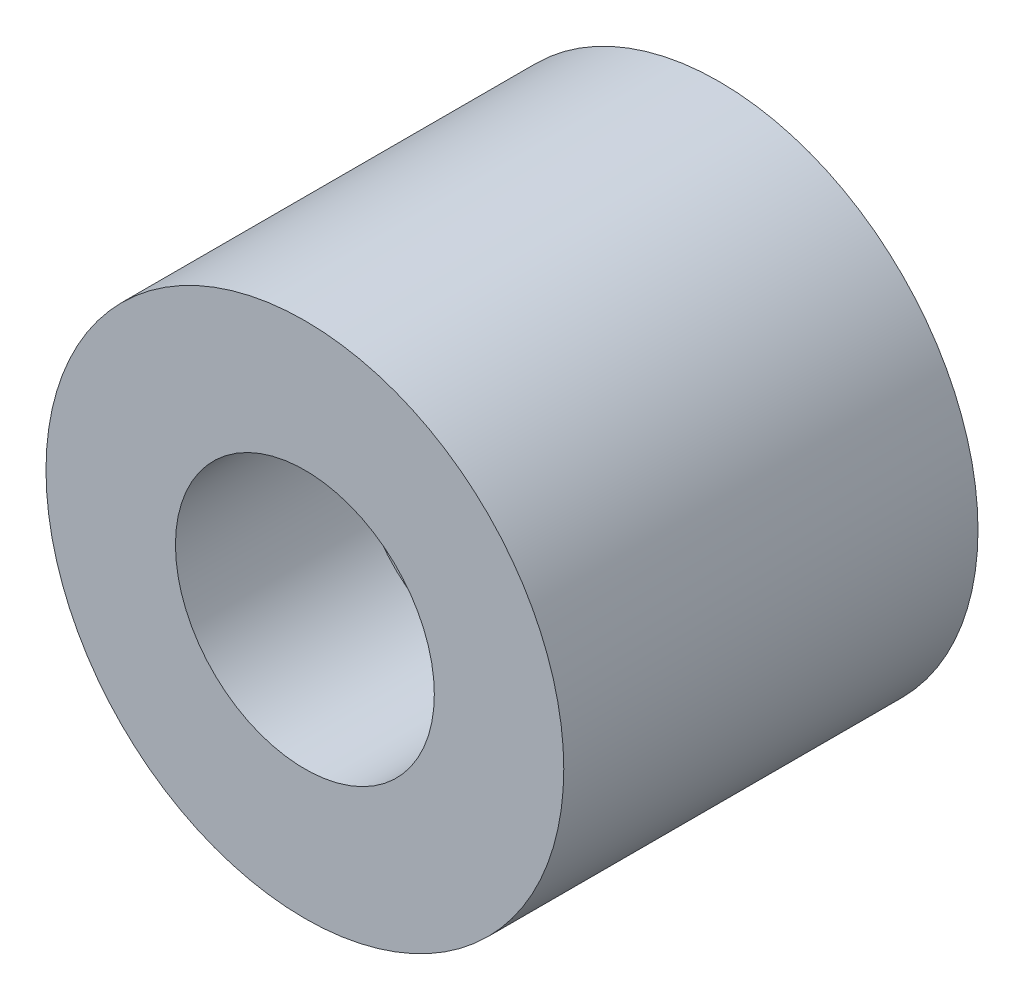
ISO-10303-21;
HEADER;
FILE_DESCRIPTION(('STEP AP214'),'2;1');
FILE_NAME('part.step','',(''),(''),'','','');
FILE_SCHEMA(('AUTOMOTIVE_DESIGN { 1 0 10303 214 1 1 1 1 }'));
ENDSEC;
DATA;
#1=APPLICATION_CONTEXT('core data for automotive mechanical design processes');
#2=APPLICATION_PROTOCOL_DEFINITION('international standard','automotive_design',2000,#1);
#3=PRODUCT_CONTEXT('',#1,'mechanical');
#4=PRODUCT('Part','Part','',(#3));
#5=PRODUCT_RELATED_PRODUCT_CATEGORY('part','',(#4));
#6=PRODUCT_DEFINITION_FORMATION('','',#4);
#7=PRODUCT_DEFINITION_CONTEXT('part definition',#1,'design');
#8=PRODUCT_DEFINITION('design','',#6,#7);
#9=PRODUCT_DEFINITION_SHAPE('','',#8);
#10=(LENGTH_UNIT() NAMED_UNIT(*) SI_UNIT(.MILLI.,.METRE.));
#11=(NAMED_UNIT(*) PLANE_ANGLE_UNIT() SI_UNIT($,.RADIAN.));
#12=(NAMED_UNIT(*) SI_UNIT($,.STERADIAN.) SOLID_ANGLE_UNIT());
#13=UNCERTAINTY_MEASURE_WITH_UNIT(LENGTH_MEASURE(1.E-05),#10,'distance_accuracy_value','');
#14=(GEOMETRIC_REPRESENTATION_CONTEXT(3) GLOBAL_UNCERTAINTY_ASSIGNED_CONTEXT((#13)) GLOBAL_UNIT_ASSIGNED_CONTEXT((#10,
#11,#12)) REPRESENTATION_CONTEXT('',''));
#15=CARTESIAN_POINT('',(0.,0.,0.));
#16=DIRECTION('',(0.,0.,1.));
#17=DIRECTION('',(1.,0.,0.));
#18=AXIS2_PLACEMENT_3D('',#15,#16,#17);
#19=CARTESIAN_POINT('',(0.,0.,10.16));
#20=DIRECTION('',(0.,0.,-1.));
#21=DIRECTION('',(-1.,0.,0.));
#22=AXIS2_PLACEMENT_3D('',#19,#20,#21);
#23=CYLINDRICAL_SURFACE('',#22,6.35);
#24=CARTESIAN_POINT('',(0.,0.,10.16));
#25=DIRECTION('',(0.,0.,1.));
#26=DIRECTION('',(1.,0.,0.));
#27=AXIS2_PLACEMENT_3D('',#24,#25,#26);
#28=CIRCLE('',#27,6.35);
#29=CARTESIAN_POINT('',(6.35,0.,10.16));
#30=VERTEX_POINT('',#29);
#31=EDGE_CURVE('E10',#30,#30,#28,.T.);
#32=ORIENTED_EDGE('',*,*,#31,.F.);
#33=EDGE_LOOP('',(#32));
#34=FACE_BOUND('',#33,.T.);
#35=CARTESIAN_POINT('',(0.,0.,0.));
#36=DIRECTION('',(0.,0.,1.));
#37=DIRECTION('',(1.,0.,0.));
#38=AXIS2_PLACEMENT_3D('',#35,#36,#37);
#39=CIRCLE('',#38,6.35);
#40=CARTESIAN_POINT('',(6.35,0.,0.));
#41=VERTEX_POINT('',#40);
#42=EDGE_CURVE('E46',#41,#41,#39,.T.);
#43=ORIENTED_EDGE('',*,*,#42,.T.);
#44=EDGE_LOOP('',(#43));
#45=FACE_BOUND('',#44,.T.);
#46=ADVANCED_FACE('F43',(#34,#45),#23,.T.);
#47=CARTESIAN_POINT('',(0.,0.,10.16));
#48=DIRECTION('',(0.,0.,1.));
#49=DIRECTION('',(1.,0.,0.));
#50=AXIS2_PLACEMENT_3D('',#47,#48,#49);
#51=PLANE('',#50);
#52=CARTESIAN_POINT('',(0.,0.,10.16));
#53=DIRECTION('',(0.,0.,1.));
#54=DIRECTION('',(1.,0.,0.));
#55=AXIS2_PLACEMENT_3D('',#52,#53,#54);
#56=CIRCLE('',#55,3.175);
#57=CARTESIAN_POINT('',(3.175,0.,10.16));
#58=VERTEX_POINT('',#57);
#59=EDGE_CURVE('E57',#58,#58,#56,.T.);
#60=ORIENTED_EDGE('',*,*,#59,.F.);
#61=EDGE_LOOP('',(#60));
#62=FACE_BOUND('',#61,.T.);
#63=ORIENTED_EDGE('',*,*,#31,.T.);
#64=EDGE_LOOP('',(#63));
#65=FACE_BOUND('',#64,.T.);
#66=ADVANCED_FACE('F86',(#62,#65),#51,.T.);
#67=CARTESIAN_POINT('',(0.,0.,0.));
#68=DIRECTION('',(0.,0.,1.));
#69=DIRECTION('',(1.,0.,0.));
#70=AXIS2_PLACEMENT_3D('',#67,#68,#69);
#71=PLANE('',#70);
#72=CARTESIAN_POINT('',(0.,0.,0.));
#73=DIRECTION('',(0.,0.,-1.));
#74=DIRECTION('',(-1.,0.,0.));
#75=AXIS2_PLACEMENT_3D('',#72,#73,#74);
#76=CIRCLE('',#75,2.921);
#77=CARTESIAN_POINT('',(-2.921,0.,0.));
#78=VERTEX_POINT('',#77);
#79=EDGE_CURVE('E65',#78,#78,#76,.T.);
#80=ORIENTED_EDGE('',*,*,#79,.F.);
#81=EDGE_LOOP('',(#80));
#82=FACE_BOUND('',#81,.T.);
#83=ORIENTED_EDGE('',*,*,#42,.F.);
#84=EDGE_LOOP('',(#83));
#85=FACE_BOUND('',#84,.T.);
#86=ADVANCED_FACE('F82',(#82,#85),#71,.F.);
#87=CARTESIAN_POINT('',(0.,0.,5.715));
#88=DIRECTION('',(0.,0.,1.));
#89=DIRECTION('',(1.,0.,0.));
#90=AXIS2_PLACEMENT_3D('',#87,#88,#89);
#91=CYLINDRICAL_SURFACE('',#90,3.175);
#92=CARTESIAN_POINT('',(0.,0.,5.715));
#93=DIRECTION('',(0.,0.,1.));
#94=DIRECTION('',(1.,0.,0.));
#95=AXIS2_PLACEMENT_3D('',#92,#93,#94);
#96=CIRCLE('',#95,3.175);
#97=CARTESIAN_POINT('',(3.175,0.,5.715));
#98=VERTEX_POINT('',#97);
#99=EDGE_CURVE('E55',#98,#98,#96,.T.);
#100=ORIENTED_EDGE('',*,*,#99,.F.);
#101=EDGE_LOOP('',(#100));
#102=FACE_BOUND('',#101,.T.);
#103=ORIENTED_EDGE('',*,*,#59,.T.);
#104=EDGE_LOOP('',(#103));
#105=FACE_BOUND('',#104,.T.);
#106=ADVANCED_FACE('F85',(#102,#105),#91,.F.);
#107=CARTESIAN_POINT('',(0.,0.,5.715));
#108=DIRECTION('',(0.,0.,1.));
#109=DIRECTION('',(1.,0.,0.));
#110=AXIS2_PLACEMENT_3D('',#107,#108,#109);
#111=PLANE('',#110);
#112=ORIENTED_EDGE('',*,*,#99,.T.);
#113=EDGE_LOOP('',(#112));
#114=FACE_BOUND('',#113,.T.);
#115=ADVANCED_FACE('F78',(#114),#111,.T.);
#116=CARTESIAN_POINT('',(0.,0.,4.445));
#117=DIRECTION('',(0.,0.,-1.));
#118=DIRECTION('',(-1.,0.,0.));
#119=AXIS2_PLACEMENT_3D('',#116,#117,#118);
#120=CYLINDRICAL_SURFACE('',#119,2.921);
#121=CARTESIAN_POINT('',(0.,0.,4.445));
#122=DIRECTION('',(0.,0.,-1.));
#123=DIRECTION('',(-1.,0.,0.));
#124=AXIS2_PLACEMENT_3D('',#121,#122,#123);
#125=CIRCLE('',#124,2.921);
#126=CARTESIAN_POINT('',(-2.921,0.,4.445));
#127=VERTEX_POINT('',#126);
#128=EDGE_CURVE('E61',#127,#127,#125,.T.);
#129=ORIENTED_EDGE('',*,*,#128,.F.);
#130=EDGE_LOOP('',(#129));
#131=FACE_BOUND('',#130,.T.);
#132=ORIENTED_EDGE('',*,*,#79,.T.);
#133=EDGE_LOOP('',(#132));
#134=FACE_BOUND('',#133,.T.);
#135=ADVANCED_FACE('F75',(#131,#134),#120,.F.);
#136=CARTESIAN_POINT('',(0.,0.,4.445));
#137=DIRECTION('',(0.,0.,-1.));
#138=DIRECTION('',(-1.,0.,0.));
#139=AXIS2_PLACEMENT_3D('',#136,#137,#138);
#140=PLANE('',#139);
#141=ORIENTED_EDGE('',*,*,#128,.T.);
#142=EDGE_LOOP('',(#141));
#143=FACE_BOUND('',#142,.T.);
#144=ADVANCED_FACE('F73',(#143),#140,.T.);
#145=CLOSED_SHELL('',(#46,#66,#86,#106,#115,#135,#144));
#146=MANIFOLD_SOLID_BREP('B2',#145);
#147=ADVANCED_BREP_SHAPE_REPRESENTATION('',(#18,#146),#14);
#148=SHAPE_DEFINITION_REPRESENTATION(#9,#147);
ENDSEC;
END-ISO-10303-21;
